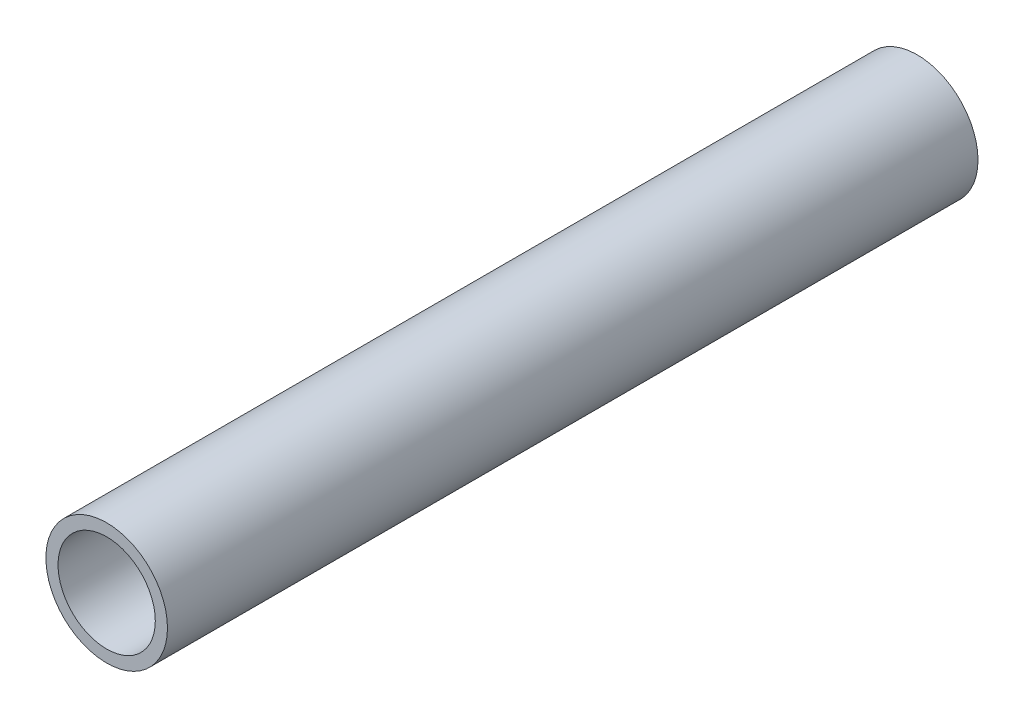
ISO-10303-21;
HEADER;
FILE_DESCRIPTION(('STEP AP214'),'2;1');
FILE_NAME('part.step','',(''),(''),'','','');
FILE_SCHEMA(('AUTOMOTIVE_DESIGN { 1 0 10303 214 1 1 1 1 }'));
ENDSEC;
DATA;
#1=APPLICATION_CONTEXT('core data for automotive mechanical design processes');
#2=APPLICATION_PROTOCOL_DEFINITION('international standard','automotive_design',2000,#1);
#3=PRODUCT_CONTEXT('',#1,'mechanical');
#4=PRODUCT('Part','Part','',(#3));
#5=PRODUCT_RELATED_PRODUCT_CATEGORY('part','',(#4));
#6=PRODUCT_DEFINITION_FORMATION('','',#4);
#7=PRODUCT_DEFINITION_CONTEXT('part definition',#1,'design');
#8=PRODUCT_DEFINITION('design','',#6,#7);
#9=PRODUCT_DEFINITION_SHAPE('','',#8);
#10=(LENGTH_UNIT() NAMED_UNIT(*) SI_UNIT(.MILLI.,.METRE.));
#11=(NAMED_UNIT(*) PLANE_ANGLE_UNIT() SI_UNIT($,.RADIAN.));
#12=(NAMED_UNIT(*) SI_UNIT($,.STERADIAN.) SOLID_ANGLE_UNIT());
#13=UNCERTAINTY_MEASURE_WITH_UNIT(LENGTH_MEASURE(1.E-05),#10,'distance_accuracy_value','');
#14=(GEOMETRIC_REPRESENTATION_CONTEXT(3) GLOBAL_UNCERTAINTY_ASSIGNED_CONTEXT((#13)) GLOBAL_UNIT_ASSIGNED_CONTEXT((#10,
#11,#12)) REPRESENTATION_CONTEXT('',''));
#15=CARTESIAN_POINT('',(0.,0.,0.));
#16=DIRECTION('',(0.,0.,1.));
#17=DIRECTION('',(1.,0.,0.));
#18=AXIS2_PLACEMENT_3D('',#15,#16,#17);
#19=CARTESIAN_POINT('',(0.,0.,200.));
#20=DIRECTION('',(0.,0.,1.));
#21=DIRECTION('',(1.,0.,0.));
#22=AXIS2_PLACEMENT_3D('',#19,#20,#21);
#23=PLANE('',#22);
#24=CARTESIAN_POINT('',(0.,0.,200.));
#25=DIRECTION('',(0.,0.,1.));
#26=DIRECTION('',(1.,0.,0.));
#27=AXIS2_PLACEMENT_3D('',#24,#25,#26);
#28=CIRCLE('',#27,15.);
#29=CARTESIAN_POINT('',(15.,0.,200.));
#30=VERTEX_POINT('',#29);
#31=EDGE_CURVE('E10',#30,#30,#28,.T.);
#32=ORIENTED_EDGE('',*,*,#31,.T.);
#33=EDGE_LOOP('',(#32));
#34=FACE_BOUND('',#33,.T.);
#35=CARTESIAN_POINT('',(0.,0.,200.));
#36=DIRECTION('',(0.,0.,1.));
#37=DIRECTION('',(1.,0.,0.));
#38=AXIS2_PLACEMENT_3D('',#35,#36,#37);
#39=CIRCLE('',#38,12.);
#40=CARTESIAN_POINT('',(12.,0.,200.));
#41=VERTEX_POINT('',#40);
#42=EDGE_CURVE('E43',#41,#41,#39,.T.);
#43=ORIENTED_EDGE('',*,*,#42,.F.);
#44=EDGE_LOOP('',(#43));
#45=FACE_BOUND('',#44,.T.);
#46=ADVANCED_FACE('F32',(#34,#45),#23,.T.);
#47=CARTESIAN_POINT('',(0.,0.,0.));
#48=DIRECTION('',(0.,0.,1.));
#49=DIRECTION('',(1.,0.,0.));
#50=AXIS2_PLACEMENT_3D('',#47,#48,#49);
#51=PLANE('',#50);
#52=CARTESIAN_POINT('',(0.,0.,0.));
#53=DIRECTION('',(0.,0.,1.));
#54=DIRECTION('',(1.,0.,0.));
#55=AXIS2_PLACEMENT_3D('',#52,#53,#54);
#56=CIRCLE('',#55,15.);
#57=CARTESIAN_POINT('',(15.,0.,0.));
#58=VERTEX_POINT('',#57);
#59=EDGE_CURVE('E36',#58,#58,#56,.T.);
#60=ORIENTED_EDGE('',*,*,#59,.F.);
#61=EDGE_LOOP('',(#60));
#62=FACE_BOUND('',#61,.T.);
#63=CARTESIAN_POINT('',(0.,0.,0.));
#64=DIRECTION('',(0.,0.,1.));
#65=DIRECTION('',(1.,0.,0.));
#66=AXIS2_PLACEMENT_3D('',#63,#64,#65);
#67=CIRCLE('',#66,12.);
#68=CARTESIAN_POINT('',(12.,0.,0.));
#69=VERTEX_POINT('',#68);
#70=EDGE_CURVE('E45',#69,#69,#67,.T.);
#71=ORIENTED_EDGE('',*,*,#70,.T.);
#72=EDGE_LOOP('',(#71));
#73=FACE_BOUND('',#72,.T.);
#74=ADVANCED_FACE('F55',(#62,#73),#51,.F.);
#75=CARTESIAN_POINT('',(0.,0.,200.));
#76=DIRECTION('',(0.,0.,-1.));
#77=DIRECTION('',(-1.,0.,0.));
#78=AXIS2_PLACEMENT_3D('',#75,#76,#77);
#79=CYLINDRICAL_SURFACE('',#78,15.);
#80=ORIENTED_EDGE('',*,*,#31,.F.);
#81=EDGE_LOOP('',(#80));
#82=FACE_BOUND('',#81,.T.);
#83=ORIENTED_EDGE('',*,*,#59,.T.);
#84=EDGE_LOOP('',(#83));
#85=FACE_BOUND('',#84,.T.);
#86=ADVANCED_FACE('F34',(#82,#85),#79,.T.);
#87=CARTESIAN_POINT('',(0.,0.,200.));
#88=DIRECTION('',(0.,0.,-1.));
#89=DIRECTION('',(-1.,0.,0.));
#90=AXIS2_PLACEMENT_3D('',#87,#88,#89);
#91=CYLINDRICAL_SURFACE('',#90,12.);
#92=ORIENTED_EDGE('',*,*,#42,.T.);
#93=EDGE_LOOP('',(#92));
#94=FACE_BOUND('',#93,.T.);
#95=ORIENTED_EDGE('',*,*,#70,.F.);
#96=EDGE_LOOP('',(#95));
#97=FACE_BOUND('',#96,.T.);
#98=ADVANCED_FACE('F51',(#94,#97),#91,.F.);
#99=CLOSED_SHELL('',(#46,#74,#86,#98));
#100=MANIFOLD_SOLID_BREP('B2',#99);
#101=ADVANCED_BREP_SHAPE_REPRESENTATION('',(#18,#100),#14);
#102=SHAPE_DEFINITION_REPRESENTATION(#9,#101);
ENDSEC;
END-ISO-10303-21;
